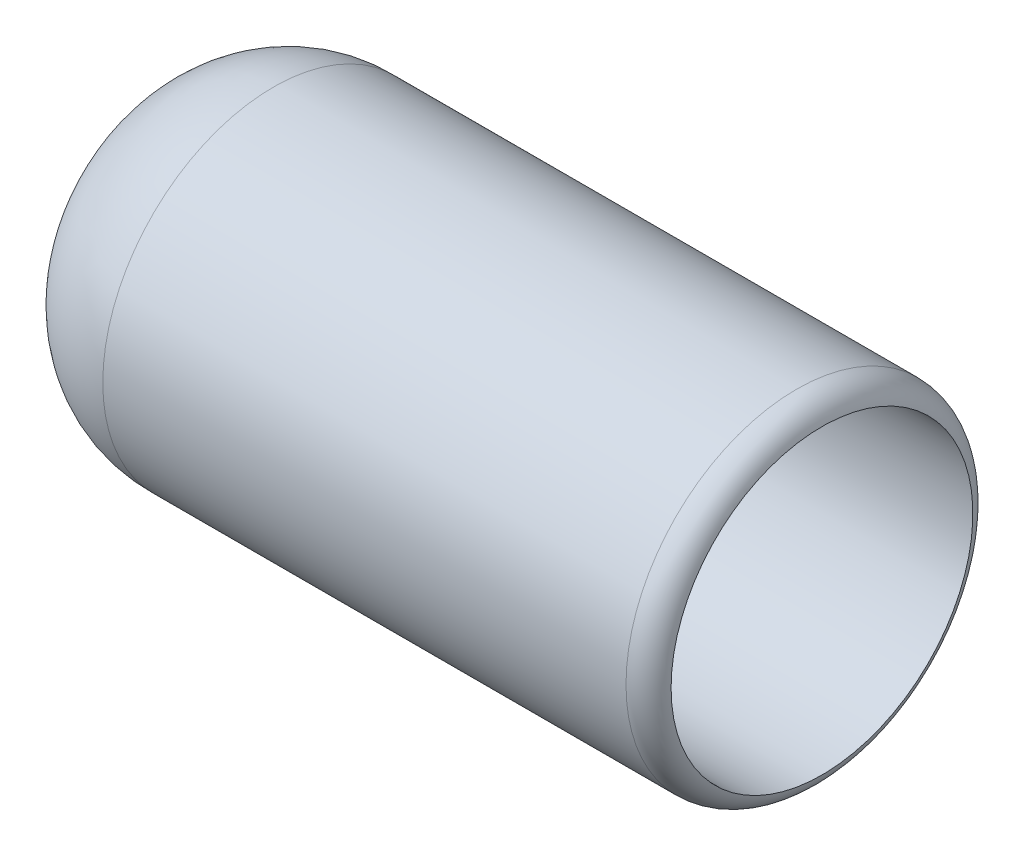
ISO-10303-21;
HEADER;
FILE_DESCRIPTION(('STEP AP214'),'2;1');
FILE_NAME('part.step','',(''),(''),'','','');
FILE_SCHEMA(('AUTOMOTIVE_DESIGN { 1 0 10303 214 1 1 1 1 }'));
ENDSEC;
DATA;
#1=APPLICATION_CONTEXT('core data for automotive mechanical design processes');
#2=APPLICATION_PROTOCOL_DEFINITION('international standard','automotive_design',2000,#1);
#3=PRODUCT_CONTEXT('',#1,'mechanical');
#4=PRODUCT('Part','Part','',(#3));
#5=PRODUCT_RELATED_PRODUCT_CATEGORY('part','',(#4));
#6=PRODUCT_DEFINITION_FORMATION('','',#4);
#7=PRODUCT_DEFINITION_CONTEXT('part definition',#1,'design');
#8=PRODUCT_DEFINITION('design','',#6,#7);
#9=PRODUCT_DEFINITION_SHAPE('','',#8);
#10=(LENGTH_UNIT() NAMED_UNIT(*) SI_UNIT(.MILLI.,.METRE.));
#11=(NAMED_UNIT(*) PLANE_ANGLE_UNIT() SI_UNIT($,.RADIAN.));
#12=(NAMED_UNIT(*) SI_UNIT($,.STERADIAN.) SOLID_ANGLE_UNIT());
#13=UNCERTAINTY_MEASURE_WITH_UNIT(LENGTH_MEASURE(1.E-05),#10,'distance_accuracy_value','');
#14=(GEOMETRIC_REPRESENTATION_CONTEXT(3) GLOBAL_UNCERTAINTY_ASSIGNED_CONTEXT((#13)) GLOBAL_UNIT_ASSIGNED_CONTEXT((#10,
#11,#12)) REPRESENTATION_CONTEXT('',''));
#15=CARTESIAN_POINT('',(0.,0.,0.));
#16=DIRECTION('',(0.,0.,1.));
#17=DIRECTION('',(1.,0.,0.));
#18=AXIS2_PLACEMENT_3D('',#15,#16,#17);
#19=CARTESIAN_POINT('',(8.00000000000037,0.,0.));
#20=DIRECTION('',(-1.,0.,0.));
#21=DIRECTION('',(0.,0.,1.));
#22=AXIS2_PLACEMENT_3D('',#19,#20,#21);
#23=DEGENERATE_TOROIDAL_SURFACE('',#22,3.00170823991985,9.99999999999993,.T.);
#24=CARTESIAN_POINT('',(0.,0.,0.));
#25=DIRECTION('',(-1.,0.,0.));
#26=DIRECTION('',(0.,0.,1.));
#27=AXIS2_PLACEMENT_3D('',#24,#25,#26);
#28=CIRCLE('',#27,9.00170823991935);
#29=CARTESIAN_POINT('',(0.,0.,9.00170823991935));
#30=VERTEX_POINT('',#29);
#31=EDGE_CURVE('E51',#30,#30,#28,.T.);
#32=ORIENTED_EDGE('',*,*,#31,.F.);
#33=EDGE_LOOP('',(#32));
#34=FACE_BOUND('',#33,.T.);
#35=CARTESIAN_POINT('',(8.18482932751838,0.,0.));
#36=DIRECTION('',(-1.,0.,0.));
#37=DIRECTION('',(0.,0.,1.));
#38=AXIS2_PLACEMENT_3D('',#35,#36,#37);
#39=CIRCLE('',#38,13.);
#40=CARTESIAN_POINT('',(8.18482932751838,0.,13.));
#41=VERTEX_POINT('',#40);
#42=EDGE_CURVE('E71',#41,#41,#39,.T.);
#43=ORIENTED_EDGE('',*,*,#42,.T.);
#44=EDGE_LOOP('',(#43));
#45=FACE_BOUND('',#44,.T.);
#46=ADVANCED_FACE('F43',(#34,#45),#23,.T.);
#47=CARTESIAN_POINT('',(0.,9.00170823991935,0.));
#48=DIRECTION('',(1.,0.,0.));
#49=DIRECTION('',(0.,0.,-1.));
#50=AXIS2_PLACEMENT_3D('',#47,#48,#49);
#51=PLANE('',#50);
#52=CARTESIAN_POINT('',(0.,0.,0.));
#53=DIRECTION('',(-1.,0.,0.));
#54=DIRECTION('',(0.,0.,1.));
#55=AXIS2_PLACEMENT_3D('',#52,#53,#54);
#56=CIRCLE('',#55,7.50170823991973);
#57=CARTESIAN_POINT('',(0.,0.,7.50170823991973));
#58=VERTEX_POINT('',#57);
#59=EDGE_CURVE('E56',#58,#58,#56,.T.);
#60=ORIENTED_EDGE('',*,*,#59,.F.);
#61=EDGE_LOOP('',(#60));
#62=FACE_BOUND('',#61,.T.);
#63=ORIENTED_EDGE('',*,*,#31,.T.);
#64=EDGE_LOOP('',(#63));
#65=FACE_BOUND('',#64,.T.);
#66=ADVANCED_FACE('F90',(#62,#65),#51,.F.);
#67=CARTESIAN_POINT('',(8.,0.,0.));
#68=DIRECTION('',(-1.,0.,0.));
#69=DIRECTION('',(0.,0.,1.));
#70=AXIS2_PLACEMENT_3D('',#67,#68,#69);
#71=DEGENERATE_TOROIDAL_SURFACE('',#70,1.50170823991972,10.,.T.);
#72=CARTESIAN_POINT('',(8.18482932751838,0.,0.));
#73=DIRECTION('',(-1.,0.,0.));
#74=DIRECTION('',(0.,0.,1.));
#75=AXIS2_PLACEMENT_3D('',#72,#73,#74);
#76=CIRCLE('',#75,11.5);
#77=CARTESIAN_POINT('',(8.18482932751838,0.,11.5));
#78=VERTEX_POINT('',#77);
#79=EDGE_CURVE('E61',#78,#78,#76,.T.);
#80=ORIENTED_EDGE('',*,*,#79,.F.);
#81=EDGE_LOOP('',(#80));
#82=FACE_BOUND('',#81,.T.);
#83=ORIENTED_EDGE('',*,*,#59,.T.);
#84=EDGE_LOOP('',(#83));
#85=FACE_BOUND('',#84,.T.);
#86=ADVANCED_FACE('F86',(#82,#85),#71,.F.);
#87=CARTESIAN_POINT('',(0.,0.,0.));
#88=DIRECTION('',(-1.,0.,0.));
#89=DIRECTION('',(0.,0.,1.));
#90=AXIS2_PLACEMENT_3D('',#87,#88,#89);
#91=CYLINDRICAL_SURFACE('',#90,11.5);
#92=CARTESIAN_POINT('',(50.,0.,0.));
#93=DIRECTION('',(-1.,0.,0.));
#94=DIRECTION('',(0.,0.,1.));
#95=AXIS2_PLACEMENT_3D('',#92,#93,#94);
#96=CIRCLE('',#95,11.5);
#97=CARTESIAN_POINT('',(50.,0.,11.5));
#98=VERTEX_POINT('',#97);
#99=EDGE_CURVE('E67',#98,#98,#96,.T.);
#100=ORIENTED_EDGE('',*,*,#99,.F.);
#101=EDGE_LOOP('',(#100));
#102=FACE_BOUND('',#101,.T.);
#103=ORIENTED_EDGE('',*,*,#79,.T.);
#104=EDGE_LOOP('',(#103));
#105=FACE_BOUND('',#104,.T.);
#106=ADVANCED_FACE('F79',(#102,#105),#91,.F.);
#107=CARTESIAN_POINT('',(0.,0.,0.));
#108=DIRECTION('',(-1.,0.,0.));
#109=DIRECTION('',(0.,0.,1.));
#110=AXIS2_PLACEMENT_3D('',#107,#108,#109);
#111=CYLINDRICAL_SURFACE('',#110,13.);
#112=CARTESIAN_POINT('',(48.0635083268963,0.,0.));
#113=DIRECTION('',(1.,0.,0.));
#114=DIRECTION('',(0.,0.,-1.));
#115=AXIS2_PLACEMENT_3D('',#112,#113,#114);
#116=CIRCLE('',#115,13.);
#117=CARTESIAN_POINT('',(48.0635083268963,0.,-13.));
#118=VERTEX_POINT('',#117);
#119=EDGE_CURVE('E10',#118,#118,#116,.F.);
#120=ORIENTED_EDGE('',*,*,#119,.T.);
#121=EDGE_LOOP('',(#120));
#122=FACE_BOUND('',#121,.T.);
#123=ORIENTED_EDGE('',*,*,#42,.F.);
#124=EDGE_LOOP('',(#123));
#125=FACE_BOUND('',#124,.T.);
#126=ADVANCED_FACE('F77',(#122,#125),#111,.T.);
#127=CARTESIAN_POINT('',(48.0635083268963,0.,0.));
#128=DIRECTION('',(1.,0.,0.));
#129=DIRECTION('',(0.,0.,-1.));
#130=AXIS2_PLACEMENT_3D('',#127,#128,#129);
#131=TOROIDAL_SURFACE('',#130,11.,2.);
#132=ORIENTED_EDGE('',*,*,#99,.T.);
#133=EDGE_LOOP('',(#132));
#134=FACE_BOUND('',#133,.T.);
#135=ORIENTED_EDGE('',*,*,#119,.F.);
#136=EDGE_LOOP('',(#135));
#137=FACE_BOUND('',#136,.T.);
#138=ADVANCED_FACE('F45',(#134,#137),#131,.T.);
#139=CLOSED_SHELL('',(#46,#66,#86,#106,#126,#138));
#140=MANIFOLD_SOLID_BREP('B2',#139);
#141=ADVANCED_BREP_SHAPE_REPRESENTATION('',(#18,#140),#14);
#142=SHAPE_DEFINITION_REPRESENTATION(#9,#141);
ENDSEC;
END-ISO-10303-21;
